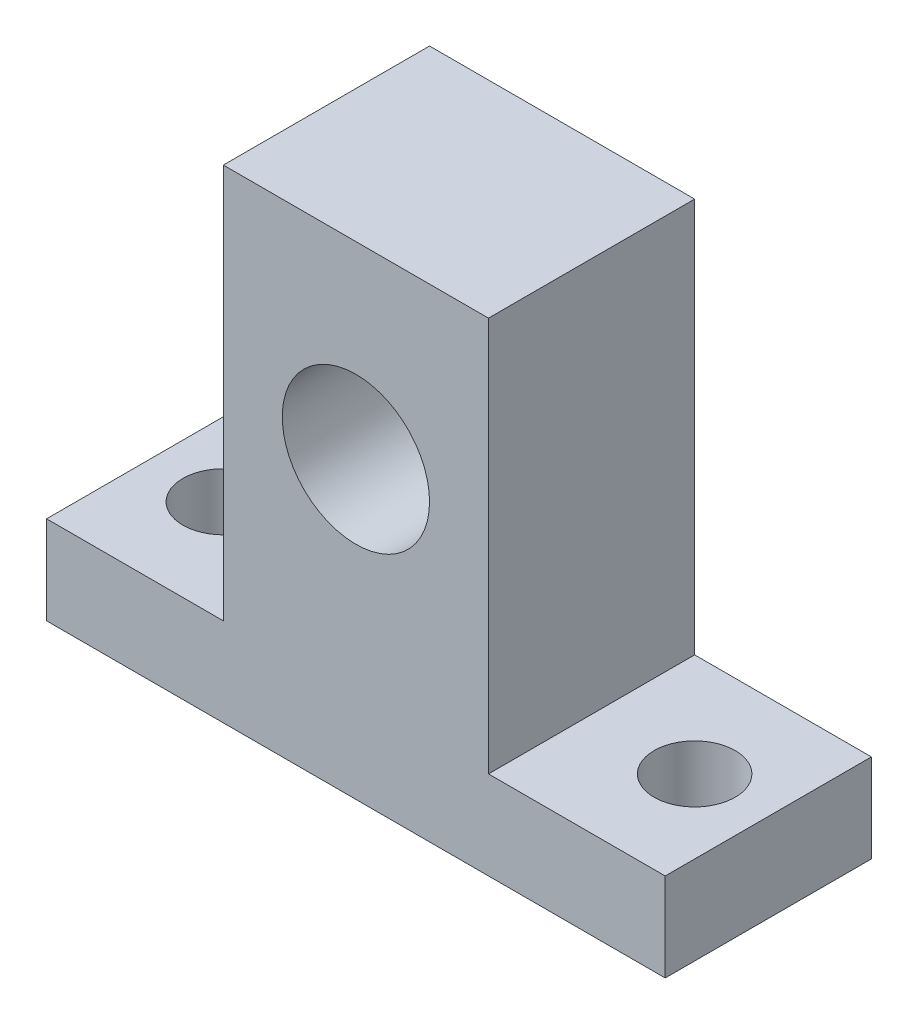
ISO-10303-21;
HEADER;
FILE_DESCRIPTION(('STEP AP214'),'2;1');
FILE_NAME('part.step','',(''),(''),'','','');
FILE_SCHEMA(('AUTOMOTIVE_DESIGN { 1 0 10303 214 1 1 1 1 }'));
ENDSEC;
DATA;
#1=APPLICATION_CONTEXT('core data for automotive mechanical design processes');
#2=APPLICATION_PROTOCOL_DEFINITION('international standard','automotive_design',2000,#1);
#3=PRODUCT_CONTEXT('',#1,'mechanical');
#4=PRODUCT('Part','Part','',(#3));
#5=PRODUCT_RELATED_PRODUCT_CATEGORY('part','',(#4));
#6=PRODUCT_DEFINITION_FORMATION('','',#4);
#7=PRODUCT_DEFINITION_CONTEXT('part definition',#1,'design');
#8=PRODUCT_DEFINITION('design','',#6,#7);
#9=PRODUCT_DEFINITION_SHAPE('','',#8);
#10=(LENGTH_UNIT() NAMED_UNIT(*) SI_UNIT(.MILLI.,.METRE.));
#11=(NAMED_UNIT(*) PLANE_ANGLE_UNIT() SI_UNIT($,.RADIAN.));
#12=(NAMED_UNIT(*) SI_UNIT($,.STERADIAN.) SOLID_ANGLE_UNIT());
#13=UNCERTAINTY_MEASURE_WITH_UNIT(LENGTH_MEASURE(1.E-05),#10,'distance_accuracy_value','');
#14=(GEOMETRIC_REPRESENTATION_CONTEXT(3) GLOBAL_UNCERTAINTY_ASSIGNED_CONTEXT((#13)) GLOBAL_UNIT_ASSIGNED_CONTEXT((#10,
#11,#12)) REPRESENTATION_CONTEXT('',''));
#15=CARTESIAN_POINT('',(0.,0.,0.));
#16=DIRECTION('',(0.,0.,1.));
#17=DIRECTION('',(1.,0.,0.));
#18=AXIS2_PLACEMENT_3D('',#15,#16,#17);
#19=CARTESIAN_POINT('',(0.,0.,7.));
#20=DIRECTION('',(0.,0.,1.));
#21=DIRECTION('',(1.,0.,0.));
#22=AXIS2_PLACEMENT_3D('',#19,#20,#21);
#23=PLANE('',#22);
#24=DIRECTION('',(-1.08680425769947E-11,-1.,0.));
#25=VECTOR('',#24,1.);
#26=CARTESIAN_POINT('',(-21.,6.,7.));
#27=LINE('',#26,#25);
#28=CARTESIAN_POINT('',(-21.,6.,7.));
#29=VERTEX_POINT('',#28);
#30=CARTESIAN_POINT('',(-21.0000000000652,0.,7.));
#31=VERTEX_POINT('',#30);
#32=EDGE_CURVE('E145',#29,#31,#27,.T.);
#33=ORIENTED_EDGE('',*,*,#32,.T.);
#34=DIRECTION('',(1.,0.,0.));
#35=VECTOR('',#34,1.);
#36=CARTESIAN_POINT('',(-21.0000000000652,0.,7.));
#37=LINE('',#36,#35);
#38=CARTESIAN_POINT('',(21.,0.,7.));
#39=VERTEX_POINT('',#38);
#40=EDGE_CURVE('E93',#31,#39,#37,.T.);
#41=ORIENTED_EDGE('',*,*,#40,.T.);
#42=DIRECTION('',(0.,1.,0.));
#43=VECTOR('',#42,1.);
#44=CARTESIAN_POINT('',(21.,0.,7.));
#45=LINE('',#44,#43);
#46=CARTESIAN_POINT('',(21.,6.00000000000001,7.));
#47=VERTEX_POINT('',#46);
#48=EDGE_CURVE('E160',#39,#47,#45,.T.);
#49=ORIENTED_EDGE('',*,*,#48,.T.);
#50=DIRECTION('',(-1.,0.,0.));
#51=VECTOR('',#50,1.);
#52=CARTESIAN_POINT('',(21.,6.00000000000001,7.));
#53=LINE('',#52,#51);
#54=CARTESIAN_POINT('',(8.99999999999746,6.,7.));
#55=VERTEX_POINT('',#54);
#56=EDGE_CURVE('E173',#47,#55,#53,.T.);
#57=ORIENTED_EDGE('',*,*,#56,.T.);
#58=DIRECTION('',(0.,1.,0.));
#59=VECTOR('',#58,1.);
#60=CARTESIAN_POINT('',(8.99999999999746,6.,7.));
#61=LINE('',#60,#59);
#62=CARTESIAN_POINT('',(9.,32.8,7.));
#63=VERTEX_POINT('',#62);
#64=EDGE_CURVE('E112',#55,#63,#61,.T.);
#65=ORIENTED_EDGE('',*,*,#64,.T.);
#66=DIRECTION('',(-1.,0.,0.));
#67=VECTOR('',#66,1.);
#68=CARTESIAN_POINT('',(9.,32.8,7.));
#69=LINE('',#68,#67);
#70=CARTESIAN_POINT('',(-9.,32.8,7.));
#71=VERTEX_POINT('',#70);
#72=EDGE_CURVE('E106',#63,#71,#69,.T.);
#73=ORIENTED_EDGE('',*,*,#72,.T.);
#74=DIRECTION('',(0.,-1.,0.));
#75=VECTOR('',#74,1.);
#76=CARTESIAN_POINT('',(-9.,32.8,7.));
#77=LINE('',#76,#75);
#78=CARTESIAN_POINT('',(-9.,6.,7.));
#79=VERTEX_POINT('',#78);
#80=EDGE_CURVE('E110',#71,#79,#77,.T.);
#81=ORIENTED_EDGE('',*,*,#80,.T.);
#82=DIRECTION('',(-1.,0.,0.));
#83=VECTOR('',#82,1.);
#84=CARTESIAN_POINT('',(-9.,6.,7.));
#85=LINE('',#84,#83);
#86=EDGE_CURVE('E50',#79,#29,#85,.T.);
#87=ORIENTED_EDGE('',*,*,#86,.T.);
#88=EDGE_LOOP('',(#33,#41,#49,#57,#65,#73,#81,#87));
#89=FACE_BOUND('',#88,.T.);
#90=CARTESIAN_POINT('',(0.,20.,7.));
#91=DIRECTION('',(0.,0.,1.));
#92=DIRECTION('',(1.,0.,0.));
#93=AXIS2_PLACEMENT_3D('',#90,#91,#92);
#94=CIRCLE('',#93,5.);
#95=CARTESIAN_POINT('',(5.,20.,7.));
#96=VERTEX_POINT('',#95);
#97=EDGE_CURVE('E134',#96,#96,#94,.T.);
#98=ORIENTED_EDGE('',*,*,#97,.F.);
#99=EDGE_LOOP('',(#98));
#100=FACE_BOUND('',#99,.T.);
#101=ADVANCED_FACE('F33',(#89,#100),#23,.T.);
#102=CARTESIAN_POINT('',(0.,0.,-7.));
#103=DIRECTION('',(0.,0.,1.));
#104=DIRECTION('',(1.,0.,0.));
#105=AXIS2_PLACEMENT_3D('',#102,#103,#104);
#106=PLANE('',#105);
#107=DIRECTION('',(-1.08680425769947E-11,-1.,0.));
#108=VECTOR('',#107,1.);
#109=CARTESIAN_POINT('',(-21.,6.,-7.));
#110=LINE('',#109,#108);
#111=CARTESIAN_POINT('',(-21.,6.,-7.));
#112=VERTEX_POINT('',#111);
#113=CARTESIAN_POINT('',(-21.0000000000652,0.,-7.));
#114=VERTEX_POINT('',#113);
#115=EDGE_CURVE('E130',#112,#114,#110,.T.);
#116=ORIENTED_EDGE('',*,*,#115,.F.);
#117=DIRECTION('',(-1.,0.,0.));
#118=VECTOR('',#117,1.);
#119=CARTESIAN_POINT('',(-9.,6.,-7.));
#120=LINE('',#119,#118);
#121=CARTESIAN_POINT('',(-9.,6.,-7.));
#122=VERTEX_POINT('',#121);
#123=EDGE_CURVE('E85',#122,#112,#120,.T.);
#124=ORIENTED_EDGE('',*,*,#123,.F.);
#125=DIRECTION('',(0.,-1.,0.));
#126=VECTOR('',#125,1.);
#127=CARTESIAN_POINT('',(-9.,32.8,-7.));
#128=LINE('',#127,#126);
#129=CARTESIAN_POINT('',(-9.,32.8,-7.));
#130=VERTEX_POINT('',#129);
#131=EDGE_CURVE('E79',#130,#122,#128,.T.);
#132=ORIENTED_EDGE('',*,*,#131,.F.);
#133=DIRECTION('',(-1.,0.,0.));
#134=VECTOR('',#133,1.);
#135=CARTESIAN_POINT('',(9.,32.8,-7.));
#136=LINE('',#135,#134);
#137=CARTESIAN_POINT('',(9.,32.8,-7.));
#138=VERTEX_POINT('',#137);
#139=EDGE_CURVE('E120',#138,#130,#136,.T.);
#140=ORIENTED_EDGE('',*,*,#139,.F.);
#141=DIRECTION('',(0.,1.,0.));
#142=VECTOR('',#141,1.);
#143=CARTESIAN_POINT('',(8.99999999999746,6.,-7.));
#144=LINE('',#143,#142);
#145=CARTESIAN_POINT('',(8.99999999999746,6.,-7.));
#146=VERTEX_POINT('',#145);
#147=EDGE_CURVE('E140',#146,#138,#144,.T.);
#148=ORIENTED_EDGE('',*,*,#147,.F.);
#149=DIRECTION('',(-1.,0.,0.));
#150=VECTOR('',#149,1.);
#151=CARTESIAN_POINT('',(21.,6.00000000000001,-7.));
#152=LINE('',#151,#150);
#153=CARTESIAN_POINT('',(21.,6.00000000000001,-7.));
#154=VERTEX_POINT('',#153);
#155=EDGE_CURVE('E138',#154,#146,#152,.T.);
#156=ORIENTED_EDGE('',*,*,#155,.F.);
#157=DIRECTION('',(0.,1.,0.));
#158=VECTOR('',#157,1.);
#159=CARTESIAN_POINT('',(21.,0.,-7.));
#160=LINE('',#159,#158);
#161=CARTESIAN_POINT('',(21.,0.,-7.));
#162=VERTEX_POINT('',#161);
#163=EDGE_CURVE('E136',#162,#154,#160,.T.);
#164=ORIENTED_EDGE('',*,*,#163,.F.);
#165=DIRECTION('',(1.,0.,0.));
#166=VECTOR('',#165,1.);
#167=CARTESIAN_POINT('',(-21.0000000000652,0.,-7.));
#168=LINE('',#167,#166);
#169=EDGE_CURVE('E133',#114,#162,#168,.T.);
#170=ORIENTED_EDGE('',*,*,#169,.F.);
#171=EDGE_LOOP('',(#116,#124,#132,#140,#148,#156,#164,#170));
#172=FACE_BOUND('',#171,.T.);
#173=CARTESIAN_POINT('',(0.,20.,-7.));
#174=DIRECTION('',(0.,0.,1.));
#175=DIRECTION('',(1.,0.,0.));
#176=AXIS2_PLACEMENT_3D('',#173,#174,#175);
#177=CIRCLE('',#176,5.);
#178=CARTESIAN_POINT('',(5.,20.,-7.));
#179=VERTEX_POINT('',#178);
#180=EDGE_CURVE('E179',#179,#179,#177,.T.);
#181=ORIENTED_EDGE('',*,*,#180,.T.);
#182=EDGE_LOOP('',(#181));
#183=FACE_BOUND('',#182,.T.);
#184=ADVANCED_FACE('F164',(#172,#183),#106,.F.);
#185=CARTESIAN_POINT('',(-21.,6.,7.));
#186=DIRECTION('',(1.,-1.08680425769947E-11,0.));
#187=DIRECTION('',(1.08680425769947E-11,1.,0.));
#188=AXIS2_PLACEMENT_3D('',#185,#186,#187);
#189=PLANE('',#188);
#190=ORIENTED_EDGE('',*,*,#115,.T.);
#191=DIRECTION('',(0.,0.,-1.));
#192=VECTOR('',#191,1.);
#193=CARTESIAN_POINT('',(-21.0000000000652,0.,7.));
#194=LINE('',#193,#192);
#195=EDGE_CURVE('E11',#31,#114,#194,.T.);
#196=ORIENTED_EDGE('',*,*,#195,.F.);
#197=ORIENTED_EDGE('',*,*,#32,.F.);
#198=DIRECTION('',(0.,0.,-1.));
#199=VECTOR('',#198,1.);
#200=CARTESIAN_POINT('',(-21.,6.,7.));
#201=LINE('',#200,#199);
#202=EDGE_CURVE('E126',#29,#112,#201,.T.);
#203=ORIENTED_EDGE('',*,*,#202,.T.);
#204=EDGE_LOOP('',(#190,#196,#197,#203));
#205=FACE_BOUND('',#204,.T.);
#206=ADVANCED_FACE('F35',(#205),#189,.F.);
#207=CARTESIAN_POINT('',(-21.0000000000652,0.,7.));
#208=DIRECTION('',(0.,1.,0.));
#209=DIRECTION('',(0.,0.,1.));
#210=AXIS2_PLACEMENT_3D('',#207,#208,#209);
#211=PLANE('',#210);
#212=CARTESIAN_POINT('',(16.,0.,0.));
#213=DIRECTION('',(0.,1.,0.));
#214=DIRECTION('',(-1.,0.,0.));
#215=AXIS2_PLACEMENT_3D('',#212,#213,#214);
#216=CIRCLE('',#215,2.75);
#217=CARTESIAN_POINT('',(13.25,0.,0.));
#218=VERTEX_POINT('',#217);
#219=EDGE_CURVE('E188',#218,#218,#216,.T.);
#220=ORIENTED_EDGE('',*,*,#219,.T.);
#221=EDGE_LOOP('',(#220));
#222=FACE_BOUND('',#221,.T.);
#223=CARTESIAN_POINT('',(-16.,0.,0.));
#224=DIRECTION('',(0.,1.,0.));
#225=DIRECTION('',(-1.,0.,0.));
#226=AXIS2_PLACEMENT_3D('',#223,#224,#225);
#227=CIRCLE('',#226,2.75);
#228=CARTESIAN_POINT('',(-18.75,0.,0.));
#229=VERTEX_POINT('',#228);
#230=EDGE_CURVE('E182',#229,#229,#227,.T.);
#231=ORIENTED_EDGE('',*,*,#230,.T.);
#232=EDGE_LOOP('',(#231));
#233=FACE_BOUND('',#232,.T.);
#234=ORIENTED_EDGE('',*,*,#169,.T.);
#235=DIRECTION('',(0.,0.,-1.));
#236=VECTOR('',#235,1.);
#237=CARTESIAN_POINT('',(21.,0.,7.));
#238=LINE('',#237,#236);
#239=EDGE_CURVE('E42',#39,#162,#238,.T.);
#240=ORIENTED_EDGE('',*,*,#239,.F.);
#241=ORIENTED_EDGE('',*,*,#40,.F.);
#242=ORIENTED_EDGE('',*,*,#195,.T.);
#243=EDGE_LOOP('',(#234,#240,#241,#242));
#244=FACE_BOUND('',#243,.T.);
#245=ADVANCED_FACE('F197',(#222,#233,#244),#211,.F.);
#246=CARTESIAN_POINT('',(21.,0.,7.));
#247=DIRECTION('',(-1.,0.,0.));
#248=DIRECTION('',(0.,-1.,0.));
#249=AXIS2_PLACEMENT_3D('',#246,#247,#248);
#250=PLANE('',#249);
#251=ORIENTED_EDGE('',*,*,#163,.T.);
#252=DIRECTION('',(0.,0.,-1.));
#253=VECTOR('',#252,1.);
#254=CARTESIAN_POINT('',(21.,6.00000000000001,7.));
#255=LINE('',#254,#253);
#256=EDGE_CURVE('E152',#47,#154,#255,.T.);
#257=ORIENTED_EDGE('',*,*,#256,.F.);
#258=ORIENTED_EDGE('',*,*,#48,.F.);
#259=ORIENTED_EDGE('',*,*,#239,.T.);
#260=EDGE_LOOP('',(#251,#257,#258,#259));
#261=FACE_BOUND('',#260,.T.);
#262=ADVANCED_FACE('F158',(#261),#250,.F.);
#263=CARTESIAN_POINT('',(21.,6.00000000000001,7.));
#264=DIRECTION('',(0.,-1.,0.));
#265=DIRECTION('',(1.,0.,0.));
#266=AXIS2_PLACEMENT_3D('',#263,#264,#265);
#267=PLANE('',#266);
#268=CARTESIAN_POINT('',(16.,6.,0.));
#269=DIRECTION('',(0.,1.,0.));
#270=DIRECTION('',(-1.,0.,0.));
#271=AXIS2_PLACEMENT_3D('',#268,#269,#270);
#272=CIRCLE('',#271,2.75);
#273=CARTESIAN_POINT('',(13.25,6.,0.));
#274=VERTEX_POINT('',#273);
#275=EDGE_CURVE('E191',#274,#274,#272,.T.);
#276=ORIENTED_EDGE('',*,*,#275,.F.);
#277=EDGE_LOOP('',(#276));
#278=FACE_BOUND('',#277,.T.);
#279=ORIENTED_EDGE('',*,*,#155,.T.);
#280=DIRECTION('',(0.,0.,-1.));
#281=VECTOR('',#280,1.);
#282=CARTESIAN_POINT('',(8.99999999999746,6.,7.));
#283=LINE('',#282,#281);
#284=EDGE_CURVE('E149',#55,#146,#283,.T.);
#285=ORIENTED_EDGE('',*,*,#284,.F.);
#286=ORIENTED_EDGE('',*,*,#56,.F.);
#287=ORIENTED_EDGE('',*,*,#256,.T.);
#288=EDGE_LOOP('',(#279,#285,#286,#287));
#289=FACE_BOUND('',#288,.T.);
#290=ADVANCED_FACE('F169',(#278,#289),#267,.F.);
#291=CARTESIAN_POINT('',(8.99999999999746,6.,7.));
#292=DIRECTION('',(-1.,0.,0.));
#293=DIRECTION('',(0.,-1.,0.));
#294=AXIS2_PLACEMENT_3D('',#291,#292,#293);
#295=PLANE('',#294);
#296=ORIENTED_EDGE('',*,*,#147,.T.);
#297=DIRECTION('',(0.,0.,-1.));
#298=VECTOR('',#297,1.);
#299=CARTESIAN_POINT('',(9.,32.8,7.));
#300=LINE('',#299,#298);
#301=EDGE_CURVE('E121',#63,#138,#300,.T.);
#302=ORIENTED_EDGE('',*,*,#301,.F.);
#303=ORIENTED_EDGE('',*,*,#64,.F.);
#304=ORIENTED_EDGE('',*,*,#284,.T.);
#305=EDGE_LOOP('',(#296,#302,#303,#304));
#306=FACE_BOUND('',#305,.T.);
#307=ADVANCED_FACE('F172',(#306),#295,.F.);
#308=CARTESIAN_POINT('',(9.,32.8,7.));
#309=DIRECTION('',(0.,-1.,0.));
#310=DIRECTION('',(0.,0.,-1.));
#311=AXIS2_PLACEMENT_3D('',#308,#309,#310);
#312=PLANE('',#311);
#313=ORIENTED_EDGE('',*,*,#139,.T.);
#314=DIRECTION('',(0.,0.,-1.));
#315=VECTOR('',#314,1.);
#316=CARTESIAN_POINT('',(-9.,32.8,7.));
#317=LINE('',#316,#315);
#318=EDGE_CURVE('E117',#71,#130,#317,.T.);
#319=ORIENTED_EDGE('',*,*,#318,.F.);
#320=ORIENTED_EDGE('',*,*,#72,.F.);
#321=ORIENTED_EDGE('',*,*,#301,.T.);
#322=EDGE_LOOP('',(#313,#319,#320,#321));
#323=FACE_BOUND('',#322,.T.);
#324=ADVANCED_FACE('F118',(#323),#312,.F.);
#325=CARTESIAN_POINT('',(-9.,32.8,7.));
#326=DIRECTION('',(1.,0.,0.));
#327=DIRECTION('',(0.,1.,0.));
#328=AXIS2_PLACEMENT_3D('',#325,#326,#327);
#329=PLANE('',#328);
#330=ORIENTED_EDGE('',*,*,#131,.T.);
#331=DIRECTION('',(0.,0.,-1.));
#332=VECTOR('',#331,1.);
#333=CARTESIAN_POINT('',(-9.,6.,7.));
#334=LINE('',#333,#332);
#335=EDGE_CURVE('E122',#79,#122,#334,.T.);
#336=ORIENTED_EDGE('',*,*,#335,.F.);
#337=ORIENTED_EDGE('',*,*,#80,.F.);
#338=ORIENTED_EDGE('',*,*,#318,.T.);
#339=EDGE_LOOP('',(#330,#336,#337,#338));
#340=FACE_BOUND('',#339,.T.);
#341=ADVANCED_FACE('F124',(#340),#329,.F.);
#342=CARTESIAN_POINT('',(-9.,6.,7.));
#343=DIRECTION('',(0.,-1.,0.));
#344=DIRECTION('',(1.,0.,0.));
#345=AXIS2_PLACEMENT_3D('',#342,#343,#344);
#346=PLANE('',#345);
#347=CARTESIAN_POINT('',(-16.,6.,0.));
#348=DIRECTION('',(0.,1.,0.));
#349=DIRECTION('',(-1.,0.,0.));
#350=AXIS2_PLACEMENT_3D('',#347,#348,#349);
#351=CIRCLE('',#350,2.75);
#352=CARTESIAN_POINT('',(-18.75,6.,0.));
#353=VERTEX_POINT('',#352);
#354=EDGE_CURVE('E185',#353,#353,#351,.T.);
#355=ORIENTED_EDGE('',*,*,#354,.F.);
#356=EDGE_LOOP('',(#355));
#357=FACE_BOUND('',#356,.T.);
#358=ORIENTED_EDGE('',*,*,#123,.T.);
#359=ORIENTED_EDGE('',*,*,#202,.F.);
#360=ORIENTED_EDGE('',*,*,#86,.F.);
#361=ORIENTED_EDGE('',*,*,#335,.T.);
#362=EDGE_LOOP('',(#358,#359,#360,#361));
#363=FACE_BOUND('',#362,.T.);
#364=ADVANCED_FACE('F225',(#357,#363),#346,.F.);
#365=CARTESIAN_POINT('',(0.,20.,7.));
#366=DIRECTION('',(0.,0.,-1.));
#367=DIRECTION('',(-1.,0.,0.));
#368=AXIS2_PLACEMENT_3D('',#365,#366,#367);
#369=CYLINDRICAL_SURFACE('',#368,5.);
#370=ORIENTED_EDGE('',*,*,#97,.T.);
#371=EDGE_LOOP('',(#370));
#372=FACE_BOUND('',#371,.T.);
#373=ORIENTED_EDGE('',*,*,#180,.F.);
#374=EDGE_LOOP('',(#373));
#375=FACE_BOUND('',#374,.T.);
#376=ADVANCED_FACE('F222',(#372,#375),#369,.F.);
#377=CARTESIAN_POINT('',(-16.,0.,0.));
#378=DIRECTION('',(0.,1.,0.));
#379=DIRECTION('',(-1.,0.,0.));
#380=AXIS2_PLACEMENT_3D('',#377,#378,#379);
#381=CYLINDRICAL_SURFACE('',#380,2.75);
#382=ORIENTED_EDGE('',*,*,#230,.F.);
#383=EDGE_LOOP('',(#382));
#384=FACE_BOUND('',#383,.T.);
#385=ORIENTED_EDGE('',*,*,#354,.T.);
#386=EDGE_LOOP('',(#385));
#387=FACE_BOUND('',#386,.T.);
#388=ADVANCED_FACE('F203',(#384,#387),#381,.F.);
#389=CARTESIAN_POINT('',(16.,0.,0.));
#390=DIRECTION('',(0.,1.,0.));
#391=DIRECTION('',(-1.,0.,0.));
#392=AXIS2_PLACEMENT_3D('',#389,#390,#391);
#393=CYLINDRICAL_SURFACE('',#392,2.75);
#394=ORIENTED_EDGE('',*,*,#219,.F.);
#395=EDGE_LOOP('',(#394));
#396=FACE_BOUND('',#395,.T.);
#397=ORIENTED_EDGE('',*,*,#275,.T.);
#398=EDGE_LOOP('',(#397));
#399=FACE_BOUND('',#398,.T.);
#400=ADVANCED_FACE('F200',(#396,#399),#393,.F.);
#401=CLOSED_SHELL('',(#101,#184,#206,#245,#262,#290,#307,#324,#341,#364,#376,#388,#400));
#402=MANIFOLD_SOLID_BREP('B2',#401);
#403=ADVANCED_BREP_SHAPE_REPRESENTATION('',(#18,#402),#14);
#404=SHAPE_DEFINITION_REPRESENTATION(#9,#403);
ENDSEC;
END-ISO-10303-21;
